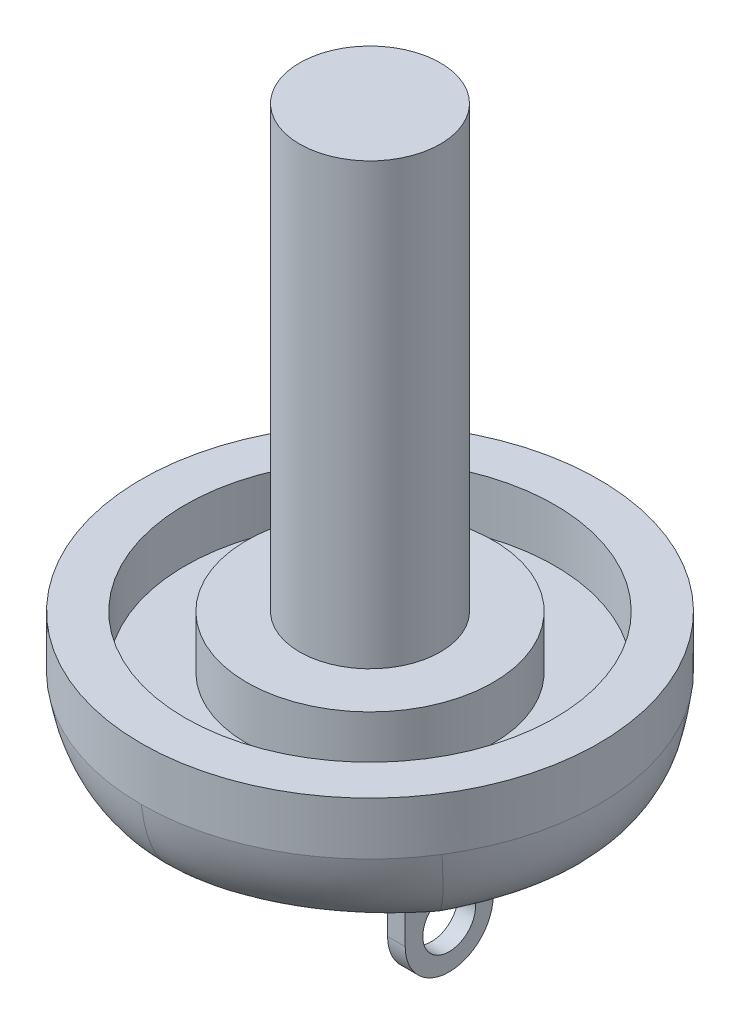
ISO-10303-21;
HEADER;
FILE_DESCRIPTION(('STEP AP214'),'2;1');
FILE_NAME('part.step','',(''),(''),'','','');
FILE_SCHEMA(('AUTOMOTIVE_DESIGN { 1 0 10303 214 1 1 1 1 }'));
ENDSEC;
DATA;
#1=APPLICATION_CONTEXT('core data for automotive mechanical design processes');
#2=APPLICATION_PROTOCOL_DEFINITION('international standard','automotive_design',2000,#1);
#3=PRODUCT_CONTEXT('',#1,'mechanical');
#4=PRODUCT('Part','Part','',(#3));
#5=PRODUCT_RELATED_PRODUCT_CATEGORY('part','',(#4));
#6=PRODUCT_DEFINITION_FORMATION('','',#4);
#7=PRODUCT_DEFINITION_CONTEXT('part definition',#1,'design');
#8=PRODUCT_DEFINITION('design','',#6,#7);
#9=PRODUCT_DEFINITION_SHAPE('','',#8);
#10=(LENGTH_UNIT() NAMED_UNIT(*) SI_UNIT(.MILLI.,.METRE.));
#11=(NAMED_UNIT(*) PLANE_ANGLE_UNIT() SI_UNIT($,.RADIAN.));
#12=(NAMED_UNIT(*) SI_UNIT($,.STERADIAN.) SOLID_ANGLE_UNIT());
#13=UNCERTAINTY_MEASURE_WITH_UNIT(LENGTH_MEASURE(1.E-05),#10,'distance_accuracy_value','');
#14=(GEOMETRIC_REPRESENTATION_CONTEXT(3) GLOBAL_UNCERTAINTY_ASSIGNED_CONTEXT((#13)) GLOBAL_UNIT_ASSIGNED_CONTEXT((#10,
#11,#12)) REPRESENTATION_CONTEXT('',''));
#15=CARTESIAN_POINT('',(0.,0.,0.));
#16=DIRECTION('',(0.,0.,1.));
#17=DIRECTION('',(1.,0.,0.));
#18=AXIS2_PLACEMENT_3D('',#15,#16,#17);
#19=CARTESIAN_POINT('',(90.,0.,0.));
#20=DIRECTION('',(-1.,0.,0.));
#21=DIRECTION('',(0.,0.,1.));
#22=AXIS2_PLACEMENT_3D('',#19,#20,#21);
#23=CYLINDRICAL_SURFACE('',#22,25.);
#24=DIRECTION('',(-1.,0.,0.));
#25=VECTOR('',#24,1.);
#26=CARTESIAN_POINT('',(90.,0.,25.));
#27=LINE('',#26,#25);
#28=CARTESIAN_POINT('',(90.,0.,25.));
#29=VERTEX_POINT('',#28);
#30=CARTESIAN_POINT('',(80.,0.,25.));
#31=VERTEX_POINT('',#30);
#32=EDGE_CURVE('E262',#29,#31,#27,.T.);
#33=ORIENTED_EDGE('',*,*,#32,.T.);
#34=CARTESIAN_POINT('',(80.,0.,0.));
#35=DIRECTION('',(1.,0.,0.));
#36=DIRECTION('',(0.,0.,-1.));
#37=AXIS2_PLACEMENT_3D('',#34,#35,#36);
#38=CIRCLE('',#37,25.);
#39=CARTESIAN_POINT('',(80.,0.,-25.));
#40=VERTEX_POINT('',#39);
#41=EDGE_CURVE('E317',#31,#40,#38,.T.);
#42=ORIENTED_EDGE('',*,*,#41,.T.);
#43=DIRECTION('',(-1.,0.,0.));
#44=VECTOR('',#43,1.);
#45=CARTESIAN_POINT('',(90.,0.,-25.));
#46=LINE('',#45,#44);
#47=CARTESIAN_POINT('',(90.,0.,-25.));
#48=VERTEX_POINT('',#47);
#49=EDGE_CURVE('E278',#48,#40,#46,.T.);
#50=ORIENTED_EDGE('',*,*,#49,.F.);
#51=CARTESIAN_POINT('',(90.,0.,0.));
#52=DIRECTION('',(1.,0.,0.));
#53=DIRECTION('',(0.,0.,-1.));
#54=AXIS2_PLACEMENT_3D('',#51,#52,#53);
#55=CIRCLE('',#54,25.);
#56=EDGE_CURVE('E595',#29,#48,#55,.T.);
#57=ORIENTED_EDGE('',*,*,#56,.F.);
#58=EDGE_LOOP('',(#33,#42,#50,#57));
#59=FACE_BOUND('',#58,.T.);
#60=ADVANCED_FACE('F175',(#59),#23,.T.);
#61=CARTESIAN_POINT('',(90.,0.,0.));
#62=DIRECTION('',(-1.,0.,0.));
#63=DIRECTION('',(0.,0.,1.));
#64=AXIS2_PLACEMENT_3D('',#61,#62,#63);
#65=CYLINDRICAL_SURFACE('',#64,15.);
#66=CARTESIAN_POINT('',(80.,0.,0.));
#67=DIRECTION('',(1.,0.,0.));
#68=DIRECTION('',(0.,0.,-1.));
#69=AXIS2_PLACEMENT_3D('',#66,#67,#68);
#70=CIRCLE('',#69,15.);
#71=CARTESIAN_POINT('',(80.,0.,15.));
#72=VERTEX_POINT('',#71);
#73=EDGE_CURVE('E307',#72,#72,#70,.T.);
#74=CARTESIAN_POINT('',(90.,0.,0.));
#75=DIRECTION('',(1.,0.,0.));
#76=DIRECTION('',(0.,0.,-1.));
#77=AXIS2_PLACEMENT_3D('',#74,#75,#76);
#78=CIRCLE('',#77,15.);
#79=CARTESIAN_POINT('',(90.,0.,15.));
#80=VERTEX_POINT('',#79);
#81=EDGE_CURVE('E419',#80,#80,#78,.T.);
#82=CARTESIAN_POINT('',(80.,0.,15.));
#83=CARTESIAN_POINT('',(80.1041666666667,0.,15.));
#84=CARTESIAN_POINT('',(80.2083333333334,0.,15.));
#85=CARTESIAN_POINT('',(80.4166666666667,0.,15.));
#86=CARTESIAN_POINT('',(80.5208333333333,0.,15.));
#87=CARTESIAN_POINT('',(80.7291666666667,0.,15.));
#88=CARTESIAN_POINT('',(80.8333333333334,0.,15.));
#89=CARTESIAN_POINT('',(81.0416666666667,0.,15.));
#90=CARTESIAN_POINT('',(81.1458333333333,0.,15.));
#91=CARTESIAN_POINT('',(81.3541666666667,0.,15.));
#92=CARTESIAN_POINT('',(81.4583333333334,0.,15.));
#93=CARTESIAN_POINT('',(81.6666666666667,0.,15.));
#94=CARTESIAN_POINT('',(81.7708333333333,0.,15.));
#95=CARTESIAN_POINT('',(81.9791666666667,0.,15.));
#96=CARTESIAN_POINT('',(82.0833333333333,0.,15.));
#97=CARTESIAN_POINT('',(82.2916666666667,0.,15.));
#98=CARTESIAN_POINT('',(82.3958333333333,0.,15.));
#99=CARTESIAN_POINT('',(82.6041666666667,0.,15.));
#100=CARTESIAN_POINT('',(82.7083333333333,0.,15.));
#101=CARTESIAN_POINT('',(82.9166666666667,0.,15.));
#102=CARTESIAN_POINT('',(83.0208333333333,0.,15.));
#103=CARTESIAN_POINT('',(83.2291666666667,0.,15.));
#104=CARTESIAN_POINT('',(83.3333333333333,0.,15.));
#105=CARTESIAN_POINT('',(83.5416666666667,0.,15.));
#106=CARTESIAN_POINT('',(83.6458333333333,0.,15.));
#107=CARTESIAN_POINT('',(83.8541666666667,0.,15.));
#108=CARTESIAN_POINT('',(83.9583333333333,0.,15.));
#109=CARTESIAN_POINT('',(84.1666666666667,0.,15.));
#110=CARTESIAN_POINT('',(84.2708333333333,0.,15.));
#111=CARTESIAN_POINT('',(84.4791666666667,0.,15.));
#112=CARTESIAN_POINT('',(84.5833333333333,0.,15.));
#113=CARTESIAN_POINT('',(84.7916666666667,0.,15.));
#114=CARTESIAN_POINT('',(84.8958333333333,0.,15.));
#115=CARTESIAN_POINT('',(85.1041666666667,0.,15.));
#116=CARTESIAN_POINT('',(85.2083333333333,0.,15.));
#117=CARTESIAN_POINT('',(85.4166666666667,0.,15.));
#118=CARTESIAN_POINT('',(85.5208333333333,0.,15.));
#119=CARTESIAN_POINT('',(85.7291666666667,0.,15.));
#120=CARTESIAN_POINT('',(85.8333333333333,0.,15.));
#121=CARTESIAN_POINT('',(86.0416666666667,0.,15.));
#122=CARTESIAN_POINT('',(86.1458333333333,0.,15.));
#123=CARTESIAN_POINT('',(86.3541666666667,0.,15.));
#124=CARTESIAN_POINT('',(86.4583333333333,0.,15.));
#125=CARTESIAN_POINT('',(86.6666666666667,0.,15.));
#126=CARTESIAN_POINT('',(86.7708333333333,0.,15.));
#127=CARTESIAN_POINT('',(86.9791666666667,0.,15.));
#128=CARTESIAN_POINT('',(87.0833333333333,0.,15.));
#129=CARTESIAN_POINT('',(87.2916666666667,0.,15.));
#130=CARTESIAN_POINT('',(87.3958333333333,0.,15.));
#131=CARTESIAN_POINT('',(87.6041666666667,0.,15.));
#132=CARTESIAN_POINT('',(87.7083333333333,0.,15.));
#133=CARTESIAN_POINT('',(87.9166666666667,0.,15.));
#134=CARTESIAN_POINT('',(88.0208333333333,0.,15.));
#135=CARTESIAN_POINT('',(88.2291666666667,0.,15.));
#136=CARTESIAN_POINT('',(88.3333333333333,0.,15.));
#137=CARTESIAN_POINT('',(88.5416666666667,0.,15.));
#138=CARTESIAN_POINT('',(88.6458333333333,0.,15.));
#139=CARTESIAN_POINT('',(88.8541666666667,0.,15.));
#140=CARTESIAN_POINT('',(88.9583333333333,0.,15.));
#141=CARTESIAN_POINT('',(89.1666666666667,0.,15.));
#142=CARTESIAN_POINT('',(89.2708333333333,0.,15.));
#143=CARTESIAN_POINT('',(89.4791666666667,0.,15.));
#144=CARTESIAN_POINT('',(89.5833333333333,0.,15.));
#145=CARTESIAN_POINT('',(89.7916666666667,0.,15.));
#146=CARTESIAN_POINT('',(89.8958333333333,0.,15.));
#147=CARTESIAN_POINT('',(90.,0.,15.));
#148=B_SPLINE_CURVE_WITH_KNOTS('',3,(#82,#83,#84,#85,#86,#87,#88,#89,#90,#91,#92,#93,#94,#95,
#96,#97,#98,#99,#100,#101,#102,#103,#104,#105,#106,#107,#108,#109,#110,#111,#112,#113,#114,#115,
#116,#117,#118,#119,#120,#121,#122,#123,#124,#125,#126,#127,#128,#129,#130,#131,#132,#133,#134,
#135,#136,#137,#138,#139,#140,#141,#142,#143,#144,#145,#146,#147),.UNSPECIFIED.,.F.,.F.,(4,2,2,
2,2,2,2,2,2,2,2,2,2,2,2,2,2,2,2,2,2,2,2,2,2,2,2,2,2,2,2,2,4),(0.,0.312499999999993,
0.624999999999987,0.937499999999994,1.24999999999999,1.56249999999999,1.87499999999999,
2.18749999999998,2.49999999999999,2.81249999999998,3.12499999999999,3.43749999999998,
3.74999999999998,4.06249999999998,4.37499999999998,4.68749999999998,4.99999999999998,
5.31249999999997,5.62499999999998,5.93749999999997,6.24999999999998,6.56249999999997,
6.87499999999996,7.18749999999997,7.49999999999997,7.81249999999997,8.12499999999997,
8.43749999999997,8.74999999999997,9.06249999999996,9.37499999999997,9.68749999999996,
9.99999999999997),.UNSPECIFIED.);
#149=EDGE_CURVE('BSEAM625',#72,#80,#148,.T.);
#150=ORIENTED_EDGE('',*,*,#73,.F.);
#151=ORIENTED_EDGE('',*,*,#81,.T.);
#152=ORIENTED_EDGE('',*,*,#149,.T.);
#153=ORIENTED_EDGE('',*,*,#149,.F.);
#154=EDGE_LOOP('',(#150,#152,#151,#153));
#155=FACE_BOUND('',#154,.T.);
#156=ADVANCED_FACE('F625',(#155),#65,.F.);
#157=CARTESIAN_POINT('',(90.,0.,0.));
#158=DIRECTION('',(1.,0.,0.));
#159=DIRECTION('',(0.,0.,-1.));
#160=AXIS2_PLACEMENT_3D('',#157,#158,#159);
#161=PLANE('',#160);
#162=ORIENTED_EDGE('',*,*,#56,.T.);
#163=DIRECTION('',(0.,1.,0.));
#164=VECTOR('',#163,1.);
#165=CARTESIAN_POINT('',(90.,0.,-25.));
#166=LINE('',#165,#164);
#167=CARTESIAN_POINT('',(90.,40.,-25.));
#168=VERTEX_POINT('',#167);
#169=EDGE_CURVE('E597',#48,#168,#166,.T.);
#170=ORIENTED_EDGE('',*,*,#169,.T.);
#171=DIRECTION('',(0.,0.,-1.));
#172=VECTOR('',#171,1.);
#173=CARTESIAN_POINT('',(90.,40.,0.));
#174=LINE('',#173,#172);
#175=CARTESIAN_POINT('',(90.,40.,25.));
#176=VERTEX_POINT('',#175);
#177=EDGE_CURVE('E586',#168,#176,#174,.F.);
#178=ORIENTED_EDGE('',*,*,#177,.T.);
#179=DIRECTION('',(0.,-1.,0.));
#180=VECTOR('',#179,1.);
#181=CARTESIAN_POINT('',(90.,0.,25.));
#182=LINE('',#181,#180);
#183=EDGE_CURVE('E200',#176,#29,#182,.T.);
#184=ORIENTED_EDGE('',*,*,#183,.T.);
#185=EDGE_LOOP('',(#162,#170,#178,#184));
#186=FACE_BOUND('',#185,.T.);
#187=ORIENTED_EDGE('',*,*,#81,.F.);
#188=EDGE_LOOP('',(#187));
#189=FACE_BOUND('',#188,.T.);
#190=ADVANCED_FACE('F604',(#186,#189),#161,.T.);
#191=CARTESIAN_POINT('',(0.,0.,0.));
#192=DIRECTION('',(1.,0.,0.));
#193=DIRECTION('',(0.,0.,-1.));
#194=AXIS2_PLACEMENT_3D('',#191,#192,#193);
#195=PLANE('',#194);
#196=CARTESIAN_POINT('',(0.,0.,0.));
#197=DIRECTION('',(1.,0.,0.));
#198=DIRECTION('',(0.,0.,-1.));
#199=AXIS2_PLACEMENT_3D('',#196,#197,#198);
#200=CIRCLE('',#199,25.);
#201=CARTESIAN_POINT('',(0.,0.,25.));
#202=VERTEX_POINT('',#201);
#203=CARTESIAN_POINT('',(0.,0.,-25.));
#204=VERTEX_POINT('',#203);
#205=EDGE_CURVE('E590',#202,#204,#200,.T.);
#206=ORIENTED_EDGE('',*,*,#205,.F.);
#207=DIRECTION('',(0.,-1.,0.));
#208=VECTOR('',#207,1.);
#209=CARTESIAN_POINT('',(0.,0.,25.));
#210=LINE('',#209,#208);
#211=CARTESIAN_POINT('',(0.,40.,25.));
#212=VERTEX_POINT('',#211);
#213=EDGE_CURVE('E581',#212,#202,#210,.T.);
#214=ORIENTED_EDGE('',*,*,#213,.F.);
#215=DIRECTION('',(0.,0.,-1.));
#216=VECTOR('',#215,1.);
#217=CARTESIAN_POINT('',(0.,40.,0.));
#218=LINE('',#217,#216);
#219=CARTESIAN_POINT('',(0.,40.,-25.));
#220=VERTEX_POINT('',#219);
#221=EDGE_CURVE('E273',#220,#212,#218,.F.);
#222=ORIENTED_EDGE('',*,*,#221,.F.);
#223=DIRECTION('',(0.,1.,0.));
#224=VECTOR('',#223,1.);
#225=CARTESIAN_POINT('',(0.,0.,-25.));
#226=LINE('',#225,#224);
#227=EDGE_CURVE('E600',#204,#220,#226,.T.);
#228=ORIENTED_EDGE('',*,*,#227,.F.);
#229=EDGE_LOOP('',(#206,#214,#222,#228));
#230=FACE_BOUND('',#229,.T.);
#231=CARTESIAN_POINT('',(0.,0.,0.));
#232=DIRECTION('',(1.,0.,0.));
#233=DIRECTION('',(0.,0.,-1.));
#234=AXIS2_PLACEMENT_3D('',#231,#232,#233);
#235=CIRCLE('',#234,15.);
#236=CARTESIAN_POINT('',(0.,0.,15.));
#237=VERTEX_POINT('',#236);
#238=EDGE_CURVE('E256',#237,#237,#235,.T.);
#239=ORIENTED_EDGE('',*,*,#238,.T.);
#240=EDGE_LOOP('',(#239));
#241=FACE_BOUND('',#240,.T.);
#242=ADVANCED_FACE('F611',(#230,#241),#195,.F.);
#243=CARTESIAN_POINT('',(10.,0.,-25.));
#244=VERTEX_POINT('',#243);
#245=EDGE_CURVE('E266',#244,#204,#46,.T.);
#246=ORIENTED_EDGE('',*,*,#245,.F.);
#247=CARTESIAN_POINT('',(10.,0.,0.));
#248=DIRECTION('',(-1.,0.,0.));
#249=DIRECTION('',(0.,0.,1.));
#250=AXIS2_PLACEMENT_3D('',#247,#248,#249);
#251=CIRCLE('',#250,25.);
#252=CARTESIAN_POINT('',(10.,0.,25.));
#253=VERTEX_POINT('',#252);
#254=EDGE_CURVE('E311',#244,#253,#251,.T.);
#255=ORIENTED_EDGE('',*,*,#254,.T.);
#256=EDGE_CURVE('E269',#253,#202,#27,.T.);
#257=ORIENTED_EDGE('',*,*,#256,.T.);
#258=ORIENTED_EDGE('',*,*,#205,.T.);
#259=EDGE_LOOP('',(#246,#255,#257,#258));
#260=FACE_BOUND('',#259,.T.);
#261=ADVANCED_FACE('F177',(#260),#23,.T.);
#262=CARTESIAN_POINT('',(90.,0.,-25.));
#263=DIRECTION('',(0.,0.,1.));
#264=DIRECTION('',(1.,0.,0.));
#265=AXIS2_PLACEMENT_3D('',#262,#263,#264);
#266=PLANE('',#265);
#267=ORIENTED_EDGE('',*,*,#49,.T.);
#268=DIRECTION('',(0.,-1.,0.));
#269=VECTOR('',#268,1.);
#270=CARTESIAN_POINT('',(80.,-25.,-25.));
#271=LINE('',#270,#269);
#272=CARTESIAN_POINT('',(80.,28.9775559430033,-25.));
#273=VERTEX_POINT('',#272);
#274=EDGE_CURVE('E562',#273,#40,#271,.T.);
#275=ORIENTED_EDGE('',*,*,#274,.F.);
#276=DIRECTION('',(1.,0.,0.));
#277=VECTOR('',#276,1.);
#278=CARTESIAN_POINT('',(80.,28.9775559430033,-25.));
#279=LINE('',#278,#277);
#280=CARTESIAN_POINT('',(10.,28.9775559430033,-25.));
#281=VERTEX_POINT('',#280);
#282=EDGE_CURVE('E559',#281,#273,#279,.T.);
#283=ORIENTED_EDGE('',*,*,#282,.F.);
#284=DIRECTION('',(0.,1.,0.));
#285=VECTOR('',#284,1.);
#286=CARTESIAN_POINT('',(10.,28.9775559430033,-25.));
#287=LINE('',#286,#285);
#288=EDGE_CURVE('E564',#244,#281,#287,.T.);
#289=ORIENTED_EDGE('',*,*,#288,.F.);
#290=ORIENTED_EDGE('',*,*,#245,.T.);
#291=ORIENTED_EDGE('',*,*,#227,.T.);
#292=DIRECTION('',(1.,0.,0.));
#293=VECTOR('',#292,1.);
#294=CARTESIAN_POINT('',(90.,40.,-25.));
#295=LINE('',#294,#293);
#296=EDGE_CURVE('E261',#168,#220,#295,.F.);
#297=ORIENTED_EDGE('',*,*,#296,.F.);
#298=ORIENTED_EDGE('',*,*,#169,.F.);
#299=EDGE_LOOP('',(#267,#275,#283,#289,#290,#291,#297,#298));
#300=FACE_BOUND('',#299,.T.);
#301=ADVANCED_FACE('F570',(#300),#266,.F.);
#302=CARTESIAN_POINT('',(90.,0.,25.));
#303=DIRECTION('',(0.,0.,-1.));
#304=DIRECTION('',(-1.,0.,0.));
#305=AXIS2_PLACEMENT_3D('',#302,#303,#304);
#306=PLANE('',#305);
#307=DIRECTION('',(1.,0.,0.));
#308=VECTOR('',#307,1.);
#309=CARTESIAN_POINT('',(90.,28.9775559430033,25.));
#310=LINE('',#309,#308);
#311=CARTESIAN_POINT('',(10.,28.9775559430033,25.));
#312=VERTEX_POINT('',#311);
#313=CARTESIAN_POINT('',(80.,28.9775559430033,25.));
#314=VERTEX_POINT('',#313);
#315=EDGE_CURVE('E13',#312,#314,#310,.T.);
#316=ORIENTED_EDGE('',*,*,#315,.T.);
#317=DIRECTION('',(0.,-1.,0.));
#318=VECTOR('',#317,1.);
#319=CARTESIAN_POINT('',(80.,0.,25.));
#320=LINE('',#319,#318);
#321=EDGE_CURVE('E310',#314,#31,#320,.T.);
#322=ORIENTED_EDGE('',*,*,#321,.T.);
#323=ORIENTED_EDGE('',*,*,#32,.F.);
#324=ORIENTED_EDGE('',*,*,#183,.F.);
#325=DIRECTION('',(-1.,0.,0.));
#326=VECTOR('',#325,1.);
#327=CARTESIAN_POINT('',(90.,40.,25.));
#328=LINE('',#327,#326);
#329=CARTESIAN_POINT('',(45.,40.,25.));
#330=VERTEX_POINT('',#329);
#331=EDGE_CURVE('E249',#176,#330,#328,.T.);
#332=ORIENTED_EDGE('',*,*,#331,.T.);
#333=DIRECTION('',(-1.,0.,0.));
#334=VECTOR('',#333,1.);
#335=CARTESIAN_POINT('',(90.,40.,25.));
#336=LINE('',#335,#334);
#337=EDGE_CURVE('E229',#330,#212,#336,.T.);
#338=ORIENTED_EDGE('',*,*,#337,.T.);
#339=ORIENTED_EDGE('',*,*,#213,.T.);
#340=ORIENTED_EDGE('',*,*,#256,.F.);
#341=DIRECTION('',(0.,1.,0.));
#342=VECTOR('',#341,1.);
#343=CARTESIAN_POINT('',(10.,0.,25.));
#344=LINE('',#343,#342);
#345=EDGE_CURVE('E305',#253,#312,#344,.T.);
#346=ORIENTED_EDGE('',*,*,#345,.T.);
#347=EDGE_LOOP('',(#316,#322,#323,#324,#332,#338,#339,#340,#346));
#348=FACE_BOUND('',#347,.T.);
#349=ADVANCED_FACE('F259',(#348),#306,.F.);
#350=CARTESIAN_POINT('',(10.,0.,0.));
#351=DIRECTION('',(-1.,0.,0.));
#352=DIRECTION('',(0.,0.,1.));
#353=AXIS2_PLACEMENT_3D('',#350,#351,#352);
#354=CIRCLE('',#353,15.);
#355=CARTESIAN_POINT('',(10.,0.,15.));
#356=VERTEX_POINT('',#355);
#357=EDGE_CURVE('E302',#356,#356,#354,.T.);
#358=CARTESIAN_POINT('',(10.,0.,15.));
#359=CARTESIAN_POINT('',(9.89583333333335,0.,15.));
#360=CARTESIAN_POINT('',(9.79166666666668,0.,15.));
#361=CARTESIAN_POINT('',(9.58333333333335,0.,15.));
#362=CARTESIAN_POINT('',(9.47916666666669,0.,15.));
#363=CARTESIAN_POINT('',(9.27083333333335,0.,15.));
#364=CARTESIAN_POINT('',(9.16666666666668,0.,15.));
#365=CARTESIAN_POINT('',(8.95833333333335,0.,15.));
#366=CARTESIAN_POINT('',(8.85416666666669,0.,15.));
#367=CARTESIAN_POINT('',(8.64583333333335,0.,15.));
#368=CARTESIAN_POINT('',(8.54166666666668,0.,15.));
#369=CARTESIAN_POINT('',(8.33333333333335,0.,15.));
#370=CARTESIAN_POINT('',(8.22916666666669,0.,15.));
#371=CARTESIAN_POINT('',(8.02083333333335,0.,15.));
#372=CARTESIAN_POINT('',(7.91666666666668,0.,15.));
#373=CARTESIAN_POINT('',(7.70833333333335,0.,15.));
#374=CARTESIAN_POINT('',(7.60416666666669,0.,15.));
#375=CARTESIAN_POINT('',(7.39583333333335,0.,15.));
#376=CARTESIAN_POINT('',(7.29166666666668,0.,15.));
#377=CARTESIAN_POINT('',(7.08333333333334,0.,15.));
#378=CARTESIAN_POINT('',(6.97916666666667,0.,15.));
#379=CARTESIAN_POINT('',(6.77083333333334,0.,15.));
#380=CARTESIAN_POINT('',(6.66666666666668,0.,15.));
#381=CARTESIAN_POINT('',(6.45833333333334,0.,15.));
#382=CARTESIAN_POINT('',(6.35416666666667,0.,15.));
#383=CARTESIAN_POINT('',(6.14583333333334,0.,15.));
#384=CARTESIAN_POINT('',(6.04166666666668,0.,15.));
#385=CARTESIAN_POINT('',(5.83333333333334,0.,15.));
#386=CARTESIAN_POINT('',(5.72916666666667,0.,15.));
#387=CARTESIAN_POINT('',(5.52083333333334,0.,15.));
#388=CARTESIAN_POINT('',(5.41666666666668,0.,15.));
#389=CARTESIAN_POINT('',(5.20833333333334,0.,15.));
#390=CARTESIAN_POINT('',(5.10416666666667,0.,15.));
#391=CARTESIAN_POINT('',(4.89583333333334,0.,15.));
#392=CARTESIAN_POINT('',(4.79166666666667,0.,15.));
#393=CARTESIAN_POINT('',(4.58333333333333,0.,15.));
#394=CARTESIAN_POINT('',(4.47916666666667,0.,15.));
#395=CARTESIAN_POINT('',(4.27083333333333,0.,15.));
#396=CARTESIAN_POINT('',(4.16666666666667,0.,15.));
#397=CARTESIAN_POINT('',(3.95833333333333,0.,15.));
#398=CARTESIAN_POINT('',(3.85416666666667,0.,15.));
#399=CARTESIAN_POINT('',(3.64583333333333,0.,15.));
#400=CARTESIAN_POINT('',(3.54166666666667,0.,15.));
#401=CARTESIAN_POINT('',(3.33333333333333,0.,15.));
#402=CARTESIAN_POINT('',(3.22916666666667,0.,15.));
#403=CARTESIAN_POINT('',(3.02083333333333,0.,15.));
#404=CARTESIAN_POINT('',(2.91666666666666,0.,15.));
#405=CARTESIAN_POINT('',(2.70833333333333,0.,15.));
#406=CARTESIAN_POINT('',(2.60416666666666,0.,15.));
#407=CARTESIAN_POINT('',(2.39583333333332,0.,15.));
#408=CARTESIAN_POINT('',(2.29166666666666,0.,15.));
#409=CARTESIAN_POINT('',(2.08333333333333,0.,15.));
#410=CARTESIAN_POINT('',(1.97916666666666,0.,15.));
#411=CARTESIAN_POINT('',(1.77083333333332,0.,15.));
#412=CARTESIAN_POINT('',(1.66666666666666,0.,15.));
#413=CARTESIAN_POINT('',(1.45833333333333,0.,15.));
#414=CARTESIAN_POINT('',(1.35416666666666,0.,15.));
#415=CARTESIAN_POINT('',(1.14583333333332,0.,15.));
#416=CARTESIAN_POINT('',(1.04166666666666,0.,15.));
#417=CARTESIAN_POINT('',(0.833333333333325,0.,15.));
#418=CARTESIAN_POINT('',(0.729166666666656,0.,15.));
#419=CARTESIAN_POINT('',(0.520833333333318,0.,15.));
#420=CARTESIAN_POINT('',(0.416666666666649,0.,15.));
#421=CARTESIAN_POINT('',(0.208333333333315,0.,15.));
#422=CARTESIAN_POINT('',(0.10416666666665,0.,15.));
#423=CARTESIAN_POINT('',(0.,0.,15.));
#424=B_SPLINE_CURVE_WITH_KNOTS('',3,(#358,#359,#360,#361,#362,#363,#364,#365,#366,#367,#368,
#369,#370,#371,#372,#373,#374,#375,#376,#377,#378,#379,#380,#381,#382,#383,#384,#385,#386,#387,
#388,#389,#390,#391,#392,#393,#394,#395,#396,#397,#398,#399,#400,#401,#402,#403,#404,#405,#406,
#407,#408,#409,#410,#411,#412,#413,#414,#415,#416,#417,#418,#419,#420,#421,#422,#423),
.UNSPECIFIED.,.F.,.F.,(4,2,2,2,2,2,2,2,2,2,2,2,2,2,2,2,2,2,2,2,2,2,2,2,2,2,2,2,2,2,2,2,4),(0.,
0.312500000000007,0.625000000000001,0.937500000000008,1.25,1.56250000000001,1.875,
2.18750000000001,2.5,2.81250000000001,3.12500000000002,3.43750000000001,3.75000000000002,
4.06250000000001,4.37500000000002,4.68750000000001,5.00000000000002,5.31250000000003,
5.62500000000002,5.93750000000003,6.25000000000002,6.56250000000003,6.87500000000002,
7.18750000000003,7.50000000000003,7.81250000000003,8.12500000000004,8.43750000000003,
8.75000000000004,9.06250000000003,9.37500000000004,9.68750000000004,10.),.UNSPECIFIED.);
#425=EDGE_CURVE('BSEAM622',#356,#237,#424,.T.);
#426=ORIENTED_EDGE('',*,*,#357,.F.);
#427=ORIENTED_EDGE('',*,*,#238,.F.);
#428=ORIENTED_EDGE('',*,*,#425,.T.);
#429=ORIENTED_EDGE('',*,*,#425,.F.);
#430=EDGE_LOOP('',(#426,#428,#427,#429));
#431=FACE_BOUND('',#430,.T.);
#432=ADVANCED_FACE('F622',(#431),#65,.F.);
#433=CARTESIAN_POINT('',(155.074145899677,100.,69.1641699469938));
#434=CARTESIAN_POINT('',(151.536731965555,27.2862677095167,61.7300601419676));
#435=CARTESIAN_POINT('',(109.587038103317,72.1032074946288,37.959225098925));
#436=CARTESIAN_POINT('',(90.,40.,25.));
#437=CARTESIAN_POINT('',(152.164070277679,100.,73.795528768193));
#438=CARTESIAN_POINT('',(148.026162382533,26.8816765915756,65.7399290868739));
#439=CARTESIAN_POINT('',(107.476614138862,72.299033882533,39.2799873796019));
#440=CARTESIAN_POINT('',(88.125,40.,25.));
#441=CARTESIAN_POINT('',(145.757823650511,100.000000000001,82.689706345038));
#442=CARTESIAN_POINT('',(140.519741044207,26.0320352438998,73.606203239395));
#443=CARTESIAN_POINT('',(103.071361206515,72.710269297132,41.7763628531324));
#444=CARTESIAN_POINT('',(84.375,40.,25.));
#445=CARTESIAN_POINT('',(130.811808323658,99.9999999999988,98.7277949974531));
#446=CARTESIAN_POINT('',(123.919084464747,24.2619491029062,88.3333090798059));
#447=CARTESIAN_POINT('',(93.5688615351513,73.567009744212,46.146662434317));
#448=CARTESIAN_POINT('',(76.875,40.,25.));
#449=CARTESIAN_POINT('',(108.555709773841,100.000000000001,114.995397684356));
#450=CARTESIAN_POINT('',(100.874519901622,22.0872718439743,104.135720673982));
#451=CARTESIAN_POINT('',(80.4892686990104,74.6195765791976,50.370442700608));
#452=CARTESIAN_POINT('',(67.5,40.,25.));
#453=CARTESIAN_POINT('',(82.9405785888208,99.9999999999995,125.185288469456));
#454=CARTESIAN_POINT('',(76.7724992088061,20.4183334824663,114.733453836823));
#455=CARTESIAN_POINT('',(66.1529967642052,75.4273604293017,52.8470989909515));
#456=CARTESIAN_POINT('',(58.125,40.,25.));
#457=CARTESIAN_POINT('',(61.4089812474767,100.,129.307663719658));
#458=CARTESIAN_POINT('',(58.1452525405758,19.6597251363273,119.211009748824));
#459=CARTESIAN_POINT('',(54.1812999808186,75.7945349066222,53.803054087372));
#460=CARTESIAN_POINT('',(50.625,40.,25.));
#461=CARTESIAN_POINT('',(50.4697371652071,100.,130.));
#462=CARTESIAN_POINT('',(49.2714914434714,19.5181182450477,119.995371008157));
#463=CARTESIAN_POINT('',(48.0732457217357,75.8630741423886,53.9557744499165));
#464=CARTESIAN_POINT('',(46.875,40.,25.));
#465=CARTESIAN_POINT('',(45.,100.,130.));
#466=CARTESIAN_POINT('',(45.,19.5181182450477,119.995371008157));
#467=CARTESIAN_POINT('',(45.,75.8630741423886,53.9557744499165));
#468=CARTESIAN_POINT('',(45.,40.,25.));
#469=B_SPLINE_SURFACE_WITH_KNOTS('',3,3,((#433,#434,#435,#436),(#437,#438,#439,#440),(#441,#442,
#443,#444),(#445,#446,#447,#448),(#449,#450,#451,#452),(#453,#454,#455,#456),(#457,#458,#459,
#460),(#461,#462,#463,#464),(#465,#466,#467,#468)),.UNSPECIFIED.,.F.,.F.,.F.,(4,1,1,1,1,1,4),(4,
4),(0.839285714285714,0.859375,0.879464285714286,0.919642857142857,0.959821428571429,
0.979910714285714,1.),(0.,1.),.UNSPECIFIED.);
#470=CARTESIAN_POINT('',(45.,100.,0.));
#471=DIRECTION('',(0.,1.,0.));
#472=DIRECTION('',(0.,0.,1.));
#473=AXIS2_PLACEMENT_3D('',#470,#471,#472);
#474=CIRCLE('',#473,130.);
#475=CARTESIAN_POINT('',(45.,100.,130.));
#476=VERTEX_POINT('',#475);
#477=CARTESIAN_POINT('',(155.074295887781,100.,69.1642642598892));
#478=VERTEX_POINT('',#477);
#479=EDGE_CURVE('E252',#476,#478,#474,.T.);
#480=CARTESIAN_POINT('',(45.,100.,130.));
#481=CARTESIAN_POINT('',(45.,19.5181182450477,119.995371008157));
#482=CARTESIAN_POINT('',(45.,75.8630741423886,53.9557744499165));
#483=CARTESIAN_POINT('',(45.,40.,25.));
#484=B_SPLINE_CURVE_WITH_KNOTS('',3,(#480,#481,#482,#483),.UNSPECIFIED.,.F.,.F.,(4,4),(0.,1.),.UNSPECIFIED.);
#485=EDGE_CURVE('E234',#476,#330,#484,.T.);
#486=CARTESIAN_POINT('',(155.074145899677,100.,69.1641699469938));
#487=CARTESIAN_POINT('',(151.536731965555,27.2862677095167,61.7300601419676));
#488=CARTESIAN_POINT('',(109.587038103317,72.1032074946288,37.959225098925));
#489=CARTESIAN_POINT('',(90.,40.,25.));
#490=B_SPLINE_CURVE_WITH_KNOTS('',3,(#486,#487,#488,#489),.UNSPECIFIED.,.F.,.F.,(4,4),(0.,1.),.UNSPECIFIED.);
#491=EDGE_CURVE('E257',#478,#176,#490,.T.);
#492=ORIENTED_EDGE('',*,*,#479,.F.);
#493=ORIENTED_EDGE('',*,*,#485,.T.);
#494=ORIENTED_EDGE('',*,*,#331,.F.);
#495=ORIENTED_EDGE('',*,*,#491,.F.);
#496=EDGE_LOOP('',(#492,#493,#494,#495));
#497=FACE_BOUND('',#496,.T.);
#498=ADVANCED_FACE('F247',(#497),#469,.T.);
#499=CARTESIAN_POINT('',(155.074145899677,100.,-69.1641699469937));
#500=CARTESIAN_POINT('',(151.536731965555,27.2862677095167,-61.7300601419676));
#501=CARTESIAN_POINT('',(109.587038103317,72.1032074946288,-37.959225098925));
#502=CARTESIAN_POINT('',(90.,40.,-25.));
#503=CARTESIAN_POINT('',(158.307563249418,100.,-64.0182157140043));
#504=CARTESIAN_POINT('',(154.742920385778,27.7358133961179,-56.5802057672634));
#505=CARTESIAN_POINT('',(110.543064727812,71.8856226191798,-35.102822569102));
#506=CARTESIAN_POINT('',(90.,40.,-22.9166666666667));
#507=CARTESIAN_POINT('',(164.051597793947,100.,-53.2721738799531));
#508=CARTESIAN_POINT('',(160.55669969473,28.5849552485869,-46.0916051919103));
#509=CARTESIAN_POINT('',(112.227715609456,71.4746289655538,-29.2111058937952));
#510=CARTESIAN_POINT('',(90.,40.,-18.75));
#511=CARTESIAN_POINT('',(170.329467601503,99.9999999999999,-36.1067976065151));
#512=CARTESIAN_POINT('',(167.149518189562,29.6151641137146,-30.2162477753956));
#513=CARTESIAN_POINT('',(114.041261639834,70.9759969593164,-19.8905323034865));
#514=CARTESIAN_POINT('',(90.,40.0000000000001,-12.5));
#515=CARTESIAN_POINT('',(174.146374098765,100.,-18.2324300171287));
#516=CARTESIAN_POINT('',(171.313761837236,30.3082137138915,-14.6368098127822));
#517=CARTESIAN_POINT('',(115.125820935845,70.6405536096656,-10.1477749469816));
#518=CARTESIAN_POINT('',(90.0000000000001,39.9999999999999,-6.24999999999999));
#519=CARTESIAN_POINT('',(175.,100.,-6.07748572401669));
#520=CARTESIAN_POINT('',(172.291403436732,30.4830370364587,-4.74610159378893));
#521=CARTESIAN_POINT('',(115.363004341186,70.5559372692133,-3.41471746356114));
#522=CARTESIAN_POINT('',(90.,40.,-2.08333333333334));
#523=CARTESIAN_POINT('',(175.,100.,6.07748572401672));
#524=CARTESIAN_POINT('',(172.291403436732,30.4830370364587,4.74610159378891));
#525=CARTESIAN_POINT('',(115.363004341186,70.5559372692133,3.41471746356112));
#526=CARTESIAN_POINT('',(90.,40.,2.08333333333334));
#527=CARTESIAN_POINT('',(174.146374098765,100.,18.2324300171288));
#528=CARTESIAN_POINT('',(171.313761837236,30.3082137138915,14.6368098127822));
#529=CARTESIAN_POINT('',(115.125820935844,70.6405536096657,10.1477749469816));
#530=CARTESIAN_POINT('',(90.,40.,6.24999999999999));
#531=CARTESIAN_POINT('',(170.329467601503,100.,36.1067976065151));
#532=CARTESIAN_POINT('',(167.149518189563,29.6151641137148,30.2162477753956));
#533=CARTESIAN_POINT('',(114.041261639834,70.9759969593164,19.8905323034865));
#534=CARTESIAN_POINT('',(90.0000000000001,40.,12.5));
#535=CARTESIAN_POINT('',(164.051597793947,100.,53.2721738799532));
#536=CARTESIAN_POINT('',(160.556699694729,28.5849552485868,46.0916051919104));
#537=CARTESIAN_POINT('',(112.227715609456,71.4746289655537,29.2111058937952));
#538=CARTESIAN_POINT('',(89.9999999999999,40.,18.75));
#539=CARTESIAN_POINT('',(158.307563249418,100.,64.0182157140044));
#540=CARTESIAN_POINT('',(154.742920385778,27.7358133961179,56.5802057672634));
#541=CARTESIAN_POINT('',(110.543064727812,71.8856226191798,35.102822569102));
#542=CARTESIAN_POINT('',(90.,40.,22.9166666666667));
#543=CARTESIAN_POINT('',(155.074145899677,100.,69.1641699469938));
#544=CARTESIAN_POINT('',(151.536731965555,27.2862677095167,61.7300601419676));
#545=CARTESIAN_POINT('',(109.587038103317,72.1032074946288,37.959225098925));
#546=CARTESIAN_POINT('',(90.,40.,25.));
#547=B_SPLINE_SURFACE_WITH_KNOTS('',3,3,((#499,#500,#501,#502),(#503,#504,#505,#506),(#507,#508,
#509,#510),(#511,#512,#513,#514),(#515,#516,#517,#518),(#519,#520,#521,#522),(#523,#524,#525,
#526),(#527,#528,#529,#530),(#531,#532,#533,#534),(#535,#536,#537,#538),(#539,#540,#541,#542),
(#543,#544,#545,#546)),.UNSPECIFIED.,.F.,.F.,.F.,(4,1,1,1,2,1,1,1,4),(4,4),(0.660714285714286,
0.683035714285714,0.705357142857143,0.727678571428571,0.75,0.772321428571428,0.794642857142857,
0.816964285714286,0.839285714285714),(0.,1.),.UNSPECIFIED.);
#548=CARTESIAN_POINT('',(155.074304652408,100.,-69.1642697720626));
#549=VERTEX_POINT('',#548);
#550=EDGE_CURVE('E244',#478,#549,#474,.T.);
#551=CARTESIAN_POINT('',(155.074145899677,100.,-69.1641699469937));
#552=CARTESIAN_POINT('',(151.536731965555,27.2862677095167,-61.7300601419676));
#553=CARTESIAN_POINT('',(109.587038103317,72.1032074946288,-37.959225098925));
#554=CARTESIAN_POINT('',(90.,40.,-25.));
#555=B_SPLINE_CURVE_WITH_KNOTS('',3,(#551,#552,#553,#554),.UNSPECIFIED.,.F.,.F.,(4,4),(0.,1.),.UNSPECIFIED.);
#556=EDGE_CURVE('E460',#549,#168,#555,.T.);
#557=ORIENTED_EDGE('',*,*,#550,.F.);
#558=ORIENTED_EDGE('',*,*,#491,.T.);
#559=ORIENTED_EDGE('',*,*,#177,.F.);
#560=ORIENTED_EDGE('',*,*,#556,.F.);
#561=EDGE_LOOP('',(#557,#558,#559,#560));
#562=FACE_BOUND('',#561,.T.);
#563=ADVANCED_FACE('F432',(#562),#547,.T.);
#564=CARTESIAN_POINT('',(-65.0741458996769,100.,-69.1641699469938));
#565=CARTESIAN_POINT('',(-61.5367319655547,27.2862677095167,-61.7300601419676));
#566=CARTESIAN_POINT('',(-19.5870381033174,72.1032074946288,-37.959225098925));
#567=CARTESIAN_POINT('',(0.,40.,-25.));
#568=CARTESIAN_POINT('',(-62.1640702776787,100.,-73.795528768193));
#569=CARTESIAN_POINT('',(-58.0261623825331,26.8816765915756,-65.7399290868739));
#570=CARTESIAN_POINT('',(-17.4766141388619,72.299033882533,-39.2799873796019));
#571=CARTESIAN_POINT('',(1.87500000000003,40.,-25.));
#572=CARTESIAN_POINT('',(-55.7578236505112,100.000000000001,-82.6897063450378));
#573=CARTESIAN_POINT('',(-50.519741044207,26.0320352438997,-73.6062032393949));
#574=CARTESIAN_POINT('',(-13.0713612065147,72.7102692971319,-41.7763628531324));
#575=CARTESIAN_POINT('',(5.62500000000002,40.,-25.));
#576=CARTESIAN_POINT('',(-40.811808323658,99.9999999999989,-98.7277949974533));
#577=CARTESIAN_POINT('',(-33.919084464747,24.2619491029063,-88.333309079806));
#578=CARTESIAN_POINT('',(-3.56886153515125,73.567009744212,-46.1466624343171));
#579=CARTESIAN_POINT('',(13.125,40.,-25.));
#580=CARTESIAN_POINT('',(-18.5557097738413,100.000000000001,-114.995397684355));
#581=CARTESIAN_POINT('',(-10.874519901622,22.0872718439744,-104.135720673982));
#582=CARTESIAN_POINT('',(9.51073130098957,74.6195765791976,-50.3704427006079));
#583=CARTESIAN_POINT('',(22.5,40.,-25.));
#584=CARTESIAN_POINT('',(7.05942141117926,99.9999999999992,-125.185288469456));
#585=CARTESIAN_POINT('',(13.2275007911939,20.4183334824661,-114.733453836823));
#586=CARTESIAN_POINT('',(23.8470032357948,75.4273604293016,-52.8470989909515));
#587=CARTESIAN_POINT('',(31.875,40.,-25.));
#588=CARTESIAN_POINT('',(28.5910187525233,100.,-129.307663719658));
#589=CARTESIAN_POINT('',(31.8547474594242,19.6597251363274,-119.211009748824));
#590=CARTESIAN_POINT('',(35.8187000191814,75.7945349066223,-53.803054087372));
#591=CARTESIAN_POINT('',(39.375,40.,-25.));
#592=CARTESIAN_POINT('',(39.5302628347929,100.,-130.));
#593=CARTESIAN_POINT('',(40.7285085565286,19.5181182450477,-119.995371008157));
#594=CARTESIAN_POINT('',(41.9267542782643,75.8630741423886,-53.9557744499165));
#595=CARTESIAN_POINT('',(43.125,40.,-25.));
#596=CARTESIAN_POINT('',(50.4697371652071,100.,-130.));
#597=CARTESIAN_POINT('',(49.2714914434714,19.5181182450477,-119.995371008157));
#598=CARTESIAN_POINT('',(48.0732457217357,75.8630741423886,-53.9557744499165));
#599=CARTESIAN_POINT('',(46.875,40.,-25.));
#600=CARTESIAN_POINT('',(61.4089812474766,100.,-129.307663719658));
#601=CARTESIAN_POINT('',(58.1452525405757,19.6597251363273,-119.211009748825));
#602=CARTESIAN_POINT('',(54.1812999808185,75.7945349066223,-53.8030540873721));
#603=CARTESIAN_POINT('',(50.625,40.,-25.));
#604=CARTESIAN_POINT('',(82.9405785888209,99.9999999999993,-125.185288469455));
#605=CARTESIAN_POINT('',(76.7724992088062,20.4183334824662,-114.733453836822));
#606=CARTESIAN_POINT('',(66.1529967642053,75.4273604293016,-52.8470989909514));
#607=CARTESIAN_POINT('',(58.125,40.,-25.));
#608=CARTESIAN_POINT('',(108.555709773841,100.000000000001,-114.995397684356));
#609=CARTESIAN_POINT('',(100.874519901622,22.0872718439741,-104.135720673982));
#610=CARTESIAN_POINT('',(80.4892686990104,74.6195765791975,-50.3704427006081));
#611=CARTESIAN_POINT('',(67.5,40.,-25.));
#612=CARTESIAN_POINT('',(130.811808323658,99.9999999999995,-98.7277949974528));
#613=CARTESIAN_POINT('',(123.919084464747,24.2619491029067,-88.3333090798057));
#614=CARTESIAN_POINT('',(93.5688615351513,73.5670097442122,-46.1466624343169));
#615=CARTESIAN_POINT('',(76.875,40.,-25.));
#616=CARTESIAN_POINT('',(145.757823650511,100.,-82.6897063450381));
#617=CARTESIAN_POINT('',(140.519741044207,26.0320352438995,-73.6062032393951));
#618=CARTESIAN_POINT('',(103.071361206515,72.7102692971318,-41.7763628531325));
#619=CARTESIAN_POINT('',(84.375,40.,-25.));
#620=CARTESIAN_POINT('',(152.164070277679,100.,-73.7955287681929));
#621=CARTESIAN_POINT('',(148.026162382533,26.8816765915756,-65.7399290868739));
#622=CARTESIAN_POINT('',(107.476614138862,72.299033882533,-39.2799873796019));
#623=CARTESIAN_POINT('',(88.125,40.,-25.));
#624=CARTESIAN_POINT('',(155.074145899677,100.,-69.1641699469937));
#625=CARTESIAN_POINT('',(151.536731965555,27.2862677095167,-61.7300601419676));
#626=CARTESIAN_POINT('',(109.587038103317,72.1032074946288,-37.959225098925));
#627=CARTESIAN_POINT('',(90.,40.,-25.));
#628=B_SPLINE_SURFACE_WITH_KNOTS('',3,3,((#564,#565,#566,#567),(#568,#569,#570,#571),(#572,#573,
#574,#575),(#576,#577,#578,#579),(#580,#581,#582,#583),(#584,#585,#586,#587),(#588,#589,#590,
#591),(#592,#593,#594,#595),(#596,#597,#598,#599),(#600,#601,#602,#603),(#604,#605,#606,#607),
(#608,#609,#610,#611),(#612,#613,#614,#615),(#616,#617,#618,#619),(#620,#621,#622,#623),(#624,
#625,#626,#627)),.UNSPECIFIED.,.F.,.F.,.F.,(4,1,1,1,1,1,2,1,1,1,1,1,4),(4,4),(0.339285714285714,
0.359375,0.379464285714286,0.419642857142857,0.459821428571429,0.479910714285714,0.5,
0.520089285714286,0.540178571428571,0.580357142857143,0.620535714285714,0.640625,
0.660714285714286),(0.,1.),.UNSPECIFIED.);
#629=CARTESIAN_POINT('',(-65.0742936978785,100.,-69.1642628824807));
#630=VERTEX_POINT('',#629);
#631=EDGE_CURVE('E295',#549,#630,#474,.T.);
#632=CARTESIAN_POINT('',(-65.0741458996769,100.,-69.1641699469938));
#633=CARTESIAN_POINT('',(-61.5367319655547,27.2862677095167,-61.7300601419676));
#634=CARTESIAN_POINT('',(-19.5870381033174,72.1032074946288,-37.959225098925));
#635=CARTESIAN_POINT('',(0.,40.,-25.));
#636=B_SPLINE_CURVE_WITH_KNOTS('',3,(#632,#633,#634,#635),.UNSPECIFIED.,.F.,.F.,(4,4),(0.,1.),.UNSPECIFIED.);
#637=EDGE_CURVE('E467',#630,#220,#636,.T.);
#638=ORIENTED_EDGE('',*,*,#631,.F.);
#639=ORIENTED_EDGE('',*,*,#556,.T.);
#640=ORIENTED_EDGE('',*,*,#296,.T.);
#641=ORIENTED_EDGE('',*,*,#637,.F.);
#642=EDGE_LOOP('',(#638,#639,#640,#641));
#643=FACE_BOUND('',#642,.T.);
#644=ADVANCED_FACE('F421',(#643),#628,.T.);
#645=CARTESIAN_POINT('',(-65.0741458996769,100.,69.1641699469937));
#646=CARTESIAN_POINT('',(-61.5367319655547,27.2862677095167,61.7300601419676));
#647=CARTESIAN_POINT('',(-19.5870381033175,72.1032074946288,37.959225098925));
#648=CARTESIAN_POINT('',(0.,40.,25.));
#649=CARTESIAN_POINT('',(-68.3075632494179,100.,64.0182157140043));
#650=CARTESIAN_POINT('',(-64.7429203857776,27.735813396118,56.5802057672634));
#651=CARTESIAN_POINT('',(-20.543064727812,71.8856226191797,35.102822569102));
#652=CARTESIAN_POINT('',(0.,40.,22.9166666666667));
#653=CARTESIAN_POINT('',(-74.0515977939467,100.,53.2721738799531));
#654=CARTESIAN_POINT('',(-70.5566996947294,28.5849552485869,46.0916051919103));
#655=CARTESIAN_POINT('',(-22.227715609456,71.4746289655537,29.2111058937952));
#656=CARTESIAN_POINT('',(0.,40.,18.75));
#657=CARTESIAN_POINT('',(-80.329467601503,100.,36.1067976065151));
#658=CARTESIAN_POINT('',(-77.1495181895624,29.6151641137147,30.2162477753957));
#659=CARTESIAN_POINT('',(-24.0412616398338,70.9759969593163,19.8905323034865));
#660=CARTESIAN_POINT('',(0.,40.,12.5));
#661=CARTESIAN_POINT('',(-84.146374098765,100.,18.2324300171288));
#662=CARTESIAN_POINT('',(-81.313761837236,30.3082137138916,14.6368098127823));
#663=CARTESIAN_POINT('',(-25.1258209358446,70.6405536096657,10.1477749469817));
#664=CARTESIAN_POINT('',(0.,40.,6.25));
#665=CARTESIAN_POINT('',(-85.,100.,6.0774857240167));
#666=CARTESIAN_POINT('',(-82.2914034367317,30.4830370364587,4.74610159378893));
#667=CARTESIAN_POINT('',(-25.3630043411858,70.5559372692133,3.41471746356113));
#668=CARTESIAN_POINT('',(0.,40.,2.08333333333333));
#669=CARTESIAN_POINT('',(-85.,100.,-6.07748572401676));
#670=CARTESIAN_POINT('',(-82.2914034367317,30.4830370364587,-4.74610159378893));
#671=CARTESIAN_POINT('',(-25.3630043411858,70.5559372692133,-3.41471746356113));
#672=CARTESIAN_POINT('',(0.,40.,-2.08333333333333));
#673=CARTESIAN_POINT('',(-84.1463740987647,100.,-18.2324300171289));
#674=CARTESIAN_POINT('',(-81.3137618372358,30.3082137138916,-14.6368098127823));
#675=CARTESIAN_POINT('',(-25.1258209358444,70.6405536096657,-10.1477749469817));
#676=CARTESIAN_POINT('',(0.,40.,-6.25000000000001));
#677=CARTESIAN_POINT('',(-80.3294676015032,99.9999999999999,-36.1067976065151));
#678=CARTESIAN_POINT('',(-77.1495181895626,29.6151641137147,-30.2162477753956));
#679=CARTESIAN_POINT('',(-24.0412616398339,70.9759969593163,-19.8905323034865));
#680=CARTESIAN_POINT('',(0.,40.,-12.5));
#681=CARTESIAN_POINT('',(-74.0515977939467,100.,-53.2721738799532));
#682=CARTESIAN_POINT('',(-70.5566996947293,28.584955248587,-46.0916051919104));
#683=CARTESIAN_POINT('',(-22.227715609456,71.4746289655538,-29.2111058937953));
#684=CARTESIAN_POINT('',(0.,40.,-18.75));
#685=CARTESIAN_POINT('',(-68.3075632494179,100.,-64.0182157140044));
#686=CARTESIAN_POINT('',(-64.7429203857776,27.7358133961179,-56.5802057672634));
#687=CARTESIAN_POINT('',(-20.543064727812,71.8856226191797,-35.102822569102));
#688=CARTESIAN_POINT('',(0.,40.,-22.9166666666667));
#689=CARTESIAN_POINT('',(-65.0741458996769,100.,-69.1641699469938));
#690=CARTESIAN_POINT('',(-61.5367319655547,27.2862677095167,-61.7300601419676));
#691=CARTESIAN_POINT('',(-19.5870381033174,72.1032074946288,-37.959225098925));
#692=CARTESIAN_POINT('',(0.,40.,-25.));
#693=B_SPLINE_SURFACE_WITH_KNOTS('',3,3,((#645,#646,#647,#648),(#649,#650,#651,#652),(#653,#654,
#655,#656),(#657,#658,#659,#660),(#661,#662,#663,#664),(#665,#666,#667,#668),(#669,#670,#671,
#672),(#673,#674,#675,#676),(#677,#678,#679,#680),(#681,#682,#683,#684),(#685,#686,#687,#688),
(#689,#690,#691,#692)),.UNSPECIFIED.,.F.,.F.,.F.,(4,1,1,1,2,1,1,1,4),(4,4),(0.160714285714286,
0.183035714285714,0.205357142857143,0.227678571428571,0.25,0.272321428571429,0.294642857142857,
0.316964285714286,0.339285714285714),(0.,1.),.UNSPECIFIED.);
#694=CARTESIAN_POINT('',(-65.0743046524205,100.,69.1642697720698));
#695=VERTEX_POINT('',#694);
#696=EDGE_CURVE('E283',#630,#695,#474,.T.);
#697=CARTESIAN_POINT('',(-65.0741458996769,100.,69.1641699469937));
#698=CARTESIAN_POINT('',(-61.5367319655547,27.2862677095167,61.7300601419676));
#699=CARTESIAN_POINT('',(-19.5870381033175,72.1032074946288,37.959225098925));
#700=CARTESIAN_POINT('',(0.,40.,25.));
#701=B_SPLINE_CURVE_WITH_KNOTS('',3,(#697,#698,#699,#700),.UNSPECIFIED.,.F.,.F.,(4,4),(0.,1.),.UNSPECIFIED.);
#702=EDGE_CURVE('E237',#695,#212,#701,.T.);
#703=ORIENTED_EDGE('',*,*,#696,.F.);
#704=ORIENTED_EDGE('',*,*,#637,.T.);
#705=ORIENTED_EDGE('',*,*,#221,.T.);
#706=ORIENTED_EDGE('',*,*,#702,.F.);
#707=EDGE_LOOP('',(#703,#704,#705,#706));
#708=FACE_BOUND('',#707,.T.);
#709=ADVANCED_FACE('F388',(#708),#693,.T.);
#710=CARTESIAN_POINT('',(45.,100.,130.));
#711=CARTESIAN_POINT('',(45.,19.5181182450477,119.995371008157));
#712=CARTESIAN_POINT('',(45.,75.8630741423886,53.9557744499165));
#713=CARTESIAN_POINT('',(45.,40.,25.));
#714=CARTESIAN_POINT('',(39.5302628347929,100.,130.));
#715=CARTESIAN_POINT('',(40.7285085565286,19.5181182450477,119.995371008157));
#716=CARTESIAN_POINT('',(41.9267542782643,75.8630741423886,53.9557744499165));
#717=CARTESIAN_POINT('',(43.125,40.,25.));
#718=CARTESIAN_POINT('',(28.5910187525232,100.000000000001,129.307663719658));
#719=CARTESIAN_POINT('',(31.8547474594242,19.6597251363275,119.211009748824));
#720=CARTESIAN_POINT('',(35.8187000191814,75.7945349066224,53.803054087372));
#721=CARTESIAN_POINT('',(39.375,40.,25.));
#722=CARTESIAN_POINT('',(7.0594214111793,99.9999999999988,125.185288469456));
#723=CARTESIAN_POINT('',(13.2275007911939,20.4183334824658,114.733453836823));
#724=CARTESIAN_POINT('',(23.8470032357948,75.4273604293015,52.8470989909516));
#725=CARTESIAN_POINT('',(31.8750000000001,40.,25.));
#726=CARTESIAN_POINT('',(-18.5557097738414,100.000000000001,114.995397684356));
#727=CARTESIAN_POINT('',(-10.8745199016221,22.0872718439746,104.135720673982));
#728=CARTESIAN_POINT('',(9.51073130098949,74.6195765791977,50.3704427006079));
#729=CARTESIAN_POINT('',(22.5,40.,25.));
#730=CARTESIAN_POINT('',(-40.8118083236579,99.9999999999991,98.7277949974528));
#731=CARTESIAN_POINT('',(-33.919084464747,24.2619491029065,88.3333090798057));
#732=CARTESIAN_POINT('',(-3.56886153515122,73.5670097442121,46.1466624343169));
#733=CARTESIAN_POINT('',(13.125,40.,25.));
#734=CARTESIAN_POINT('',(-55.7578236505112,100.,82.6897063450381));
#735=CARTESIAN_POINT('',(-50.519741044207,26.0320352438996,73.6062032393951));
#736=CARTESIAN_POINT('',(-13.0713612065147,72.7102692971318,41.7763628531325));
#737=CARTESIAN_POINT('',(5.62500000000004,40.,25.));
#738=CARTESIAN_POINT('',(-62.1640702776787,100.,73.7955287681929));
#739=CARTESIAN_POINT('',(-58.0261623825331,26.8816765915756,65.7399290868739));
#740=CARTESIAN_POINT('',(-17.4766141388618,72.299033882533,39.2799873796019));
#741=CARTESIAN_POINT('',(1.87500000000003,40.,25.));
#742=CARTESIAN_POINT('',(-65.0741458996769,100.,69.1641699469937));
#743=CARTESIAN_POINT('',(-61.5367319655547,27.2862677095167,61.7300601419676));
#744=CARTESIAN_POINT('',(-19.5870381033175,72.1032074946288,37.959225098925));
#745=CARTESIAN_POINT('',(0.,40.,25.));
#746=B_SPLINE_SURFACE_WITH_KNOTS('',3,3,((#710,#711,#712,#713),(#714,#715,#716,#717),(#718,#719,
#720,#721),(#722,#723,#724,#725),(#726,#727,#728,#729),(#730,#731,#732,#733),(#734,#735,#736,
#737),(#738,#739,#740,#741),(#742,#743,#744,#745)),.UNSPECIFIED.,.F.,.F.,.F.,(4,1,1,1,1,1,4),(4,
4),(0.,0.0200892857142857,0.0401785714285714,0.0803571428571429,0.120535714285714,0.140625,
0.160714285714286),(0.,1.),.UNSPECIFIED.);
#747=EDGE_CURVE('E279',#695,#476,#474,.T.);
#748=ORIENTED_EDGE('',*,*,#747,.F.);
#749=ORIENTED_EDGE('',*,*,#702,.T.);
#750=ORIENTED_EDGE('',*,*,#337,.F.);
#751=ORIENTED_EDGE('',*,*,#485,.F.);
#752=EDGE_LOOP('',(#748,#749,#750,#751));
#753=FACE_BOUND('',#752,.T.);
#754=ADVANCED_FACE('F232',(#753),#746,.T.);
#755=CARTESIAN_POINT('',(45.,130.,0.));
#756=DIRECTION('',(0.,1.,0.));
#757=DIRECTION('',(0.,0.,1.));
#758=AXIS2_PLACEMENT_3D('',#755,#756,#757);
#759=PLANE('',#758);
#760=CARTESIAN_POINT('',(45.,130.,0.));
#761=DIRECTION('',(0.,1.,0.));
#762=DIRECTION('',(0.,0.,1.));
#763=AXIS2_PLACEMENT_3D('',#760,#761,#762);
#764=CIRCLE('',#763,130.);
#765=CARTESIAN_POINT('',(45.,130.,130.));
#766=VERTEX_POINT('',#765);
#767=EDGE_CURVE('E301',#766,#766,#764,.T.);
#768=ORIENTED_EDGE('',*,*,#767,.T.);
#769=EDGE_LOOP('',(#768));
#770=FACE_BOUND('',#769,.T.);
#771=CARTESIAN_POINT('',(45.,130.,0.));
#772=DIRECTION('',(0.,1.,0.));
#773=DIRECTION('',(0.,0.,1.));
#774=AXIS2_PLACEMENT_3D('',#771,#772,#773);
#775=CIRCLE('',#774,105.);
#776=CARTESIAN_POINT('',(45.,130.,105.));
#777=VERTEX_POINT('',#776);
#778=EDGE_CURVE('E345',#777,#777,#775,.T.);
#779=ORIENTED_EDGE('',*,*,#778,.F.);
#780=EDGE_LOOP('',(#779));
#781=FACE_BOUND('',#780,.T.);
#782=ADVANCED_FACE('F375',(#770,#781),#759,.T.);
#783=CARTESIAN_POINT('',(45.,130.,0.));
#784=DIRECTION('',(0.,-1.,0.));
#785=DIRECTION('',(0.,0.,-1.));
#786=AXIS2_PLACEMENT_3D('',#783,#784,#785);
#787=CYLINDRICAL_SURFACE('',#786,130.);
#788=ORIENTED_EDGE('',*,*,#767,.F.);
#789=EDGE_LOOP('',(#788));
#790=FACE_BOUND('',#789,.T.);
#791=ORIENTED_EDGE('',*,*,#479,.T.);
#792=ORIENTED_EDGE('',*,*,#550,.T.);
#793=ORIENTED_EDGE('',*,*,#631,.T.);
#794=ORIENTED_EDGE('',*,*,#696,.T.);
#795=ORIENTED_EDGE('',*,*,#747,.T.);
#796=EDGE_LOOP('',(#791,#792,#793,#794,#795));
#797=FACE_BOUND('',#796,.T.);
#798=ADVANCED_FACE('F364',(#790,#797),#787,.T.);
#799=CARTESIAN_POINT('',(45.,130.,0.));
#800=DIRECTION('',(0.,-1.,0.));
#801=DIRECTION('',(0.,0.,-1.));
#802=AXIS2_PLACEMENT_3D('',#799,#800,#801);
#803=CYLINDRICAL_SURFACE('',#802,105.);
#804=ORIENTED_EDGE('',*,*,#778,.T.);
#805=EDGE_LOOP('',(#804));
#806=FACE_BOUND('',#805,.T.);
#807=CARTESIAN_POINT('',(45.,100.,0.));
#808=DIRECTION('',(0.,1.,0.));
#809=DIRECTION('',(0.,0.,1.));
#810=AXIS2_PLACEMENT_3D('',#807,#808,#809);
#811=CIRCLE('',#810,105.);
#812=CARTESIAN_POINT('',(45.,100.,105.));
#813=VERTEX_POINT('',#812);
#814=EDGE_CURVE('E274',#813,#813,#811,.F.);
#815=ORIENTED_EDGE('',*,*,#814,.T.);
#816=EDGE_LOOP('',(#815));
#817=FACE_BOUND('',#816,.T.);
#818=ADVANCED_FACE('F374',(#806,#817),#803,.F.);
#819=CARTESIAN_POINT('',(45.,100.,0.));
#820=DIRECTION('',(0.,1.,0.));
#821=DIRECTION('',(0.,0.,1.));
#822=AXIS2_PLACEMENT_3D('',#819,#820,#821);
#823=PLANE('',#822);
#824=CARTESIAN_POINT('',(45.,100.,0.));
#825=DIRECTION('',(0.,1.,0.));
#826=DIRECTION('',(0.,0.,1.));
#827=AXIS2_PLACEMENT_3D('',#824,#825,#826);
#828=CIRCLE('',#827,70.);
#829=CARTESIAN_POINT('',(45.,100.,70.));
#830=VERTEX_POINT('',#829);
#831=EDGE_CURVE('E337',#830,#830,#828,.T.);
#832=ORIENTED_EDGE('',*,*,#831,.F.);
#833=EDGE_LOOP('',(#832));
#834=FACE_BOUND('',#833,.T.);
#835=ORIENTED_EDGE('',*,*,#814,.F.);
#836=EDGE_LOOP('',(#835));
#837=FACE_BOUND('',#836,.T.);
#838=ADVANCED_FACE('F378',(#834,#837),#823,.T.);
#839=CARTESIAN_POINT('',(45.,130.,0.));
#840=DIRECTION('',(0.,-1.,0.));
#841=DIRECTION('',(0.,0.,-1.));
#842=AXIS2_PLACEMENT_3D('',#839,#840,#841);
#843=CYLINDRICAL_SURFACE('',#842,70.);
#844=CARTESIAN_POINT('',(45.,130.,0.));
#845=DIRECTION('',(0.,1.,0.));
#846=DIRECTION('',(0.,0.,1.));
#847=AXIS2_PLACEMENT_3D('',#844,#845,#846);
#848=CIRCLE('',#847,70.);
#849=CARTESIAN_POINT('',(45.,130.,70.));
#850=VERTEX_POINT('',#849);
#851=EDGE_CURVE('E341',#850,#850,#848,.T.);
#852=ORIENTED_EDGE('',*,*,#851,.F.);
#853=EDGE_LOOP('',(#852));
#854=FACE_BOUND('',#853,.T.);
#855=ORIENTED_EDGE('',*,*,#831,.T.);
#856=EDGE_LOOP('',(#855));
#857=FACE_BOUND('',#856,.T.);
#858=ADVANCED_FACE('F381',(#854,#857),#843,.T.);
#859=CARTESIAN_POINT('',(45.,130.,0.));
#860=DIRECTION('',(0.,1.,0.));
#861=DIRECTION('',(0.,0.,1.));
#862=AXIS2_PLACEMENT_3D('',#859,#860,#861);
#863=PLANE('',#862);
#864=CARTESIAN_POINT('',(45.,130.,0.));
#865=DIRECTION('',(0.,1.,0.));
#866=DIRECTION('',(0.,0.,1.));
#867=AXIS2_PLACEMENT_3D('',#864,#865,#866);
#868=CIRCLE('',#867,40.);
#869=CARTESIAN_POINT('',(45.,130.,40.));
#870=VERTEX_POINT('',#869);
#871=EDGE_CURVE('E184',#870,#870,#868,.T.);
#872=ORIENTED_EDGE('',*,*,#871,.F.);
#873=EDGE_LOOP('',(#872));
#874=FACE_BOUND('',#873,.T.);
#875=ORIENTED_EDGE('',*,*,#851,.T.);
#876=EDGE_LOOP('',(#875));
#877=FACE_BOUND('',#876,.T.);
#878=ADVANCED_FACE('F745',(#874,#877),#863,.T.);
#879=CARTESIAN_POINT('',(45.,380.,0.));
#880=DIRECTION('',(0.,-1.,0.));
#881=DIRECTION('',(0.,0.,-1.));
#882=AXIS2_PLACEMENT_3D('',#879,#880,#881);
#883=CYLINDRICAL_SURFACE('',#882,40.);
#884=CARTESIAN_POINT('',(45.,380.,0.));
#885=DIRECTION('',(0.,1.,0.));
#886=DIRECTION('',(0.,0.,1.));
#887=AXIS2_PLACEMENT_3D('',#884,#885,#886);
#888=CIRCLE('',#887,40.);
#889=CARTESIAN_POINT('',(45.,380.,40.));
#890=VERTEX_POINT('',#889);
#891=EDGE_CURVE('E333',#890,#890,#888,.T.);
#892=ORIENTED_EDGE('',*,*,#891,.F.);
#893=EDGE_LOOP('',(#892));
#894=FACE_BOUND('',#893,.T.);
#895=ORIENTED_EDGE('',*,*,#871,.T.);
#896=EDGE_LOOP('',(#895));
#897=FACE_BOUND('',#896,.T.);
#898=ADVANCED_FACE('F755',(#894,#897),#883,.T.);
#899=CARTESIAN_POINT('',(45.,380.,0.));
#900=DIRECTION('',(0.,1.,0.));
#901=DIRECTION('',(0.,0.,1.));
#902=AXIS2_PLACEMENT_3D('',#899,#900,#901);
#903=PLANE('',#902);
#904=ORIENTED_EDGE('',*,*,#891,.T.);
#905=EDGE_LOOP('',(#904));
#906=FACE_BOUND('',#905,.T.);
#907=ADVANCED_FACE('F765',(#906),#903,.T.);
#908=CARTESIAN_POINT('',(80.,28.9775559430033,275.));
#909=DIRECTION('',(0.,1.,0.));
#910=DIRECTION('',(0.,0.,1.));
#911=AXIS2_PLACEMENT_3D('',#908,#909,#910);
#912=PLANE('',#911);
#913=DIRECTION('',(0.,0.,-1.));
#914=VECTOR('',#913,1.);
#915=CARTESIAN_POINT('',(10.,28.9775559430033,275.));
#916=LINE('',#915,#914);
#917=EDGE_CURVE('E191',#312,#281,#916,.T.);
#918=ORIENTED_EDGE('',*,*,#917,.T.);
#919=ORIENTED_EDGE('',*,*,#282,.T.);
#920=DIRECTION('',(0.,0.,-1.));
#921=VECTOR('',#920,1.);
#922=CARTESIAN_POINT('',(80.,28.9775559430033,275.));
#923=LINE('',#922,#921);
#924=EDGE_CURVE('E306',#314,#273,#923,.T.);
#925=ORIENTED_EDGE('',*,*,#924,.F.);
#926=ORIENTED_EDGE('',*,*,#315,.F.);
#927=EDGE_LOOP('',(#918,#919,#925,#926));
#928=FACE_BOUND('',#927,.T.);
#929=ADVANCED_FACE('F556',(#928),#912,.F.);
#930=CARTESIAN_POINT('',(80.,-25.,275.));
#931=DIRECTION('',(1.,0.,0.));
#932=DIRECTION('',(0.,0.,-1.));
#933=AXIS2_PLACEMENT_3D('',#930,#931,#932);
#934=PLANE('',#933);
#935=ORIENTED_EDGE('',*,*,#73,.T.);
#936=EDGE_LOOP('',(#935));
#937=FACE_BOUND('',#936,.T.);
#938=ORIENTED_EDGE('',*,*,#41,.F.);
#939=ORIENTED_EDGE('',*,*,#321,.F.);
#940=ORIENTED_EDGE('',*,*,#924,.T.);
#941=ORIENTED_EDGE('',*,*,#274,.T.);
#942=EDGE_LOOP('',(#938,#939,#940,#941));
#943=FACE_BOUND('',#942,.T.);
#944=ADVANCED_FACE('F579',(#937,#943),#934,.F.);
#945=CARTESIAN_POINT('',(10.,28.9775559430033,275.));
#946=DIRECTION('',(-1.,0.,0.));
#947=DIRECTION('',(0.,0.,1.));
#948=AXIS2_PLACEMENT_3D('',#945,#946,#947);
#949=PLANE('',#948);
#950=ORIENTED_EDGE('',*,*,#357,.T.);
#951=EDGE_LOOP('',(#950));
#952=FACE_BOUND('',#951,.T.);
#953=ORIENTED_EDGE('',*,*,#288,.T.);
#954=ORIENTED_EDGE('',*,*,#917,.F.);
#955=ORIENTED_EDGE('',*,*,#345,.F.);
#956=ORIENTED_EDGE('',*,*,#254,.F.);
#957=EDGE_LOOP('',(#953,#954,#955,#956));
#958=FACE_BOUND('',#957,.T.);
#959=ADVANCED_FACE('F565',(#952,#958),#949,.F.);
#960=CLOSED_SHELL('',(#60,#156,#190,#242,#261,#301,#349,#432,#498,#563,#644,#709,#754,#782,#798,
#818,#838,#858,#878,#898,#907,#929,#944,#959));
#961=MANIFOLD_SOLID_BREP('B2',#960);
#962=ADVANCED_BREP_SHAPE_REPRESENTATION('',(#18,#961),#14);
#963=SHAPE_DEFINITION_REPRESENTATION(#9,#962);
ENDSEC;
END-ISO-10303-21;
